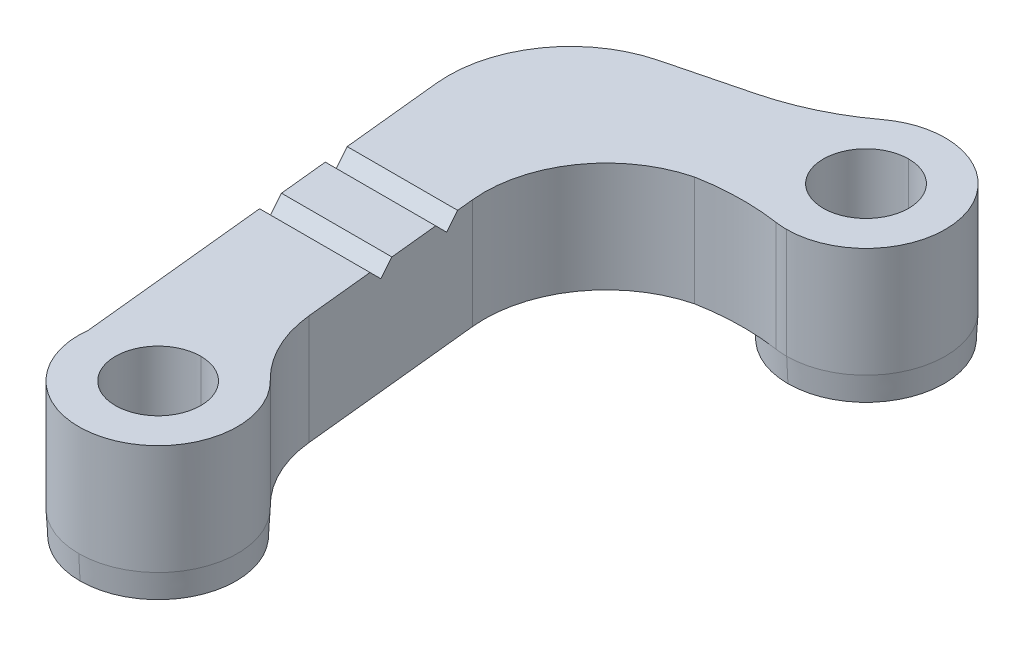
ISO-10303-21;
HEADER;
FILE_DESCRIPTION(('STEP AP214'),'2;1');
FILE_NAME('part.step','',(''),(''),'','','');
FILE_SCHEMA(('AUTOMOTIVE_DESIGN { 1 0 10303 214 1 1 1 1 }'));
ENDSEC;
DATA;
#1=APPLICATION_CONTEXT('core data for automotive mechanical design processes');
#2=APPLICATION_PROTOCOL_DEFINITION('international standard','automotive_design',2000,#1);
#3=PRODUCT_CONTEXT('',#1,'mechanical');
#4=PRODUCT('Part','Part','',(#3));
#5=PRODUCT_RELATED_PRODUCT_CATEGORY('part','',(#4));
#6=PRODUCT_DEFINITION_FORMATION('','',#4);
#7=PRODUCT_DEFINITION_CONTEXT('part definition',#1,'design');
#8=PRODUCT_DEFINITION('design','',#6,#7);
#9=PRODUCT_DEFINITION_SHAPE('','',#8);
#10=(LENGTH_UNIT() NAMED_UNIT(*) SI_UNIT(.MILLI.,.METRE.));
#11=(NAMED_UNIT(*) PLANE_ANGLE_UNIT() SI_UNIT($,.RADIAN.));
#12=(NAMED_UNIT(*) SI_UNIT($,.STERADIAN.) SOLID_ANGLE_UNIT());
#13=UNCERTAINTY_MEASURE_WITH_UNIT(LENGTH_MEASURE(1.E-05),#10,'distance_accuracy_value','');
#14=(GEOMETRIC_REPRESENTATION_CONTEXT(3) GLOBAL_UNCERTAINTY_ASSIGNED_CONTEXT((#13)) GLOBAL_UNIT_ASSIGNED_CONTEXT((#10,
#11,#12)) REPRESENTATION_CONTEXT('',''));
#15=CARTESIAN_POINT('',(0.,0.,0.));
#16=DIRECTION('',(0.,0.,1.));
#17=DIRECTION('',(1.,0.,0.));
#18=AXIS2_PLACEMENT_3D('',#15,#16,#17);
#19=CARTESIAN_POINT('',(0.,4.,-11.6880020050078));
#20=DIRECTION('',(0.,0.70710678118655,0.707106781186545));
#21=DIRECTION('',(1.,0.,0.));
#22=AXIS2_PLACEMENT_3D('',#19,#20,#21);
#23=PLANE('',#22);
#24=DIRECTION('',(0.0724619149618862,-0.705247924803771,0.705247924803775));
#25=VECTOR('',#24,1.);
#26=CARTESIAN_POINT('',(0.704052639154984,-1.5578314508662,-6.13017055414156));
#27=LINE('',#26,#25);
#28=CARTESIAN_POINT('',(0.0816302937531961,4.5,-12.1880020050078));
#29=VERTEX_POINT('',#28);
#30=CARTESIAN_POINT('',(0.133003656519239,4.,-11.6880020050078));
#31=VERTEX_POINT('',#30);
#32=EDGE_CURVE('E209',#29,#31,#27,.T.);
#33=ORIENTED_EDGE('',*,*,#32,.F.);
#34=DIRECTION('',(-1.,0.,0.));
#35=VECTOR('',#34,1.);
#36=CARTESIAN_POINT('',(0.,4.5,-12.1880020050078));
#37=LINE('',#36,#35);
#38=CARTESIAN_POINT('',(-4.44206034714536,4.5,-12.1880020050078));
#39=VERTEX_POINT('',#38);
#40=EDGE_CURVE('E271',#29,#39,#37,.T.);
#41=ORIENTED_EDGE('',*,*,#40,.T.);
#42=DIRECTION('',(-0.0724619149618862,0.705247924803771,-0.705247924803775));
#43=VECTOR('',#42,1.);
#44=CARTESIAN_POINT('',(-4.36763267637388,3.77562002208782,-11.4636220270956));
#45=LINE('',#44,#43);
#46=CARTESIAN_POINT('',(-4.39068698437932,4.,-11.6880020050078));
#47=VERTEX_POINT('',#46);
#48=EDGE_CURVE('E317',#47,#39,#45,.T.);
#49=ORIENTED_EDGE('',*,*,#48,.F.);
#50=DIRECTION('',(1.,0.,0.));
#51=VECTOR('',#50,1.);
#52=CARTESIAN_POINT('',(0.184377019285281,4.,-11.6880020050078));
#53=LINE('',#52,#51);
#54=EDGE_CURVE('E11',#47,#31,#53,.T.);
#55=ORIENTED_EDGE('',*,*,#54,.T.);
#56=EDGE_LOOP('',(#33,#41,#49,#55));
#57=FACE_BOUND('',#56,.T.);
#58=ADVANCED_FACE('F17',(#57),#23,.T.);
#59=CARTESIAN_POINT('',(0.,4.,-11.6880020050078));
#60=DIRECTION('',(0.,0.70710678118655,-0.707106781186545));
#61=DIRECTION('',(-1.,0.,0.));
#62=AXIS2_PLACEMENT_3D('',#59,#60,#61);
#63=PLANE('',#62);
#64=DIRECTION('',(1.,0.,0.));
#65=VECTOR('',#64,1.);
#66=CARTESIAN_POINT('',(0.,4.5,-11.1880020050078));
#67=LINE('',#66,#65);
#68=CARTESIAN_POINT('',(-4.33931362161327,4.5,-11.1880020050078));
#69=VERTEX_POINT('',#68);
#70=CARTESIAN_POINT('',(0.184377019285282,4.5,-11.1880020050078));
#71=VERTEX_POINT('',#70);
#72=EDGE_CURVE('E217',#69,#71,#67,.T.);
#73=ORIENTED_EDGE('',*,*,#72,.T.);
#74=DIRECTION('',(0.0724619149618862,0.705247924803771,0.705247924803775));
#75=VECTOR('',#74,1.);
#76=CARTESIAN_POINT('',(0.755156254309161,10.0552060863062,-5.63279591870154));
#77=LINE('',#76,#75);
#78=EDGE_CURVE('E202',#31,#71,#77,.T.);
#79=ORIENTED_EDGE('',*,*,#78,.F.);
#80=ORIENTED_EDGE('',*,*,#54,.F.);
#81=DIRECTION('',(-0.0724619149618862,-0.705247924803771,-0.705247924803775));
#82=VECTOR('',#81,1.);
#83=CARTESIAN_POINT('',(-4.36763267637388,4.22437997791218,-11.4636220270956));
#84=LINE('',#83,#82);
#85=EDGE_CURVE('E194',#69,#47,#84,.T.);
#86=ORIENTED_EDGE('',*,*,#85,.F.);
#87=EDGE_LOOP('',(#73,#79,#80,#86));
#88=FACE_BOUND('',#87,.T.);
#89=ADVANCED_FACE('F223',(#88),#63,.T.);
#90=CARTESIAN_POINT('',(0.,4.,-8.68800200500781));
#91=DIRECTION('',(0.,0.70710678118655,-0.707106781186545));
#92=DIRECTION('',(-1.,0.,0.));
#93=AXIS2_PLACEMENT_3D('',#90,#91,#92);
#94=PLANE('',#93);
#95=DIRECTION('',(-0.0724619149618862,-0.705247924803771,-0.705247924803775));
#96=VECTOR('',#95,1.);
#97=CARTESIAN_POINT('',(-4.06101098544881,4.20862779055234,-8.47937421445546));
#98=LINE('',#97,#96);
#99=CARTESIAN_POINT('',(-4.03107344501702,4.5,-8.1880020050078));
#100=VERTEX_POINT('',#99);
#101=CARTESIAN_POINT('',(-4.08244680778307,4.,-8.68800200500781));
#102=VERTEX_POINT('',#101);
#103=EDGE_CURVE('E255',#100,#102,#98,.T.);
#104=ORIENTED_EDGE('',*,*,#103,.F.);
#105=DIRECTION('',(1.,0.,0.));
#106=VECTOR('',#105,1.);
#107=CARTESIAN_POINT('',(0.,4.5,-8.1880020050078));
#108=LINE('',#107,#106);
#109=CARTESIAN_POINT('',(0.492617195881537,4.5,-8.1880020050078));
#110=VERTEX_POINT('',#109);
#111=EDGE_CURVE('E221',#100,#110,#108,.T.);
#112=ORIENTED_EDGE('',*,*,#111,.T.);
#113=DIRECTION('',(0.0724619149618862,0.705247924803771,0.705247924803775));
#114=VECTOR('',#113,1.);
#115=CARTESIAN_POINT('',(0.908467099771692,8.54732999262632,-4.14067201238146));
#116=LINE('',#115,#114);
#117=CARTESIAN_POINT('',(0.441243833115493,4.,-8.68800200500781));
#118=VERTEX_POINT('',#117);
#119=EDGE_CURVE('E347',#118,#110,#116,.T.);
#120=ORIENTED_EDGE('',*,*,#119,.F.);
#121=DIRECTION('',(-1.,0.,0.));
#122=VECTOR('',#121,1.);
#123=CARTESIAN_POINT('',(-4.1338201705491,4.,-8.6880020050078));
#124=LINE('',#123,#122);
#125=EDGE_CURVE('E20',#118,#102,#124,.T.);
#126=ORIENTED_EDGE('',*,*,#125,.T.);
#127=EDGE_LOOP('',(#104,#112,#120,#126));
#128=FACE_BOUND('',#127,.T.);
#129=ADVANCED_FACE('F393',(#128),#94,.T.);
#130=CARTESIAN_POINT('',(0.,4.,-8.6880020050078));
#131=DIRECTION('',(0.,0.70710678118655,0.707106781186545));
#132=DIRECTION('',(1.,0.,0.));
#133=AXIS2_PLACEMENT_3D('',#130,#131,#132);
#134=PLANE('',#133);
#135=DIRECTION('',(-1.,0.,0.));
#136=VECTOR('',#135,1.);
#137=CARTESIAN_POINT('',(0.,4.5,-9.1880020050078));
#138=LINE('',#137,#136);
#139=CARTESIAN_POINT('',(0.389870470349451,4.5,-9.18800200500781));
#140=VERTEX_POINT('',#139);
#141=CARTESIAN_POINT('',(-4.1338201705491,4.5,-9.1880020050078));
#142=VERTEX_POINT('',#141);
#143=EDGE_CURVE('E219',#140,#142,#138,.T.);
#144=ORIENTED_EDGE('',*,*,#143,.T.);
#145=DIRECTION('',(-0.0724619149618862,0.705247924803771,-0.705247924803775));
#146=VECTOR('',#145,1.);
#147=CARTESIAN_POINT('',(-4.06101098544881,3.79137220944765,-8.47937421445546));
#148=LINE('',#147,#146);
#149=EDGE_CURVE('E251',#102,#142,#148,.T.);
#150=ORIENTED_EDGE('',*,*,#149,.F.);
#151=ORIENTED_EDGE('',*,*,#125,.F.);
#152=DIRECTION('',(0.0724619149618862,-0.705247924803771,0.705247924803775));
#153=VECTOR('',#152,1.);
#154=CARTESIAN_POINT('',(0.857363484617515,-0.0499553571862892,-4.63804664782149));
#155=LINE('',#154,#153);
#156=EDGE_CURVE('E211',#140,#118,#155,.T.);
#157=ORIENTED_EDGE('',*,*,#156,.F.);
#158=EDGE_LOOP('',(#144,#150,#151,#157));
#159=FACE_BOUND('',#158,.T.);
#160=ADVANCED_FACE('F394',(#159),#134,.T.);
#161=CARTESIAN_POINT('',(7.5,0.,-21.5));
#162=DIRECTION('',(0.,-1.,0.));
#163=DIRECTION('',(0.,0.,-1.));
#164=AXIS2_PLACEMENT_3D('',#161,#162,#163);
#165=CONICAL_SURFACE('',#164,1.75,0.0523598775598306);
#166=DIRECTION('',(0.,-0.998629534754574,0.052335956242944));
#167=VECTOR('',#166,1.);
#168=CARTESIAN_POINT('',(7.5,0.,-19.75));
#169=LINE('',#168,#167);
#170=CARTESIAN_POINT('',(7.5,0.,-19.75));
#171=VERTEX_POINT('',#170);
#172=CARTESIAN_POINT('',(7.5,-1.,-19.697592220717));
#173=VERTEX_POINT('',#172);
#174=EDGE_CURVE('E634',#171,#173,#169,.T.);
#175=ORIENTED_EDGE('',*,*,#174,.F.);
#176=CARTESIAN_POINT('',(7.5,0.,-21.5));
#177=DIRECTION('',(0.,1.,0.));
#178=DIRECTION('',(0.,0.,1.));
#179=AXIS2_PLACEMENT_3D('',#176,#177,#178);
#180=CIRCLE('',#179,1.75);
#181=CARTESIAN_POINT('',(7.5,0.,-23.25));
#182=VERTEX_POINT('',#181);
#183=EDGE_CURVE('E318',#171,#182,#180,.T.);
#184=ORIENTED_EDGE('',*,*,#183,.T.);
#185=DIRECTION('',(0.,-0.998629534754574,-0.052335956242944));
#186=VECTOR('',#185,1.);
#187=CARTESIAN_POINT('',(7.5,0.,-23.25));
#188=LINE('',#187,#186);
#189=CARTESIAN_POINT('',(7.5,-1.,-23.302407779283));
#190=VERTEX_POINT('',#189);
#191=EDGE_CURVE('E643',#182,#190,#188,.T.);
#192=ORIENTED_EDGE('',*,*,#191,.T.);
#193=CARTESIAN_POINT('',(7.5,-1.,-21.5));
#194=DIRECTION('',(0.,-1.,0.));
#195=DIRECTION('',(0.,0.,-1.));
#196=AXIS2_PLACEMENT_3D('',#193,#194,#195);
#197=CIRCLE('',#196,1.80240777928305);
#198=EDGE_CURVE('E264',#190,#173,#197,.T.);
#199=ORIENTED_EDGE('',*,*,#198,.T.);
#200=EDGE_LOOP('',(#175,#184,#192,#199));
#201=FACE_BOUND('',#200,.T.);
#202=ADVANCED_FACE('F706',(#201),#165,.F.);
#203=CARTESIAN_POINT('',(7.5,0.,-21.5));
#204=DIRECTION('',(0.,1.,0.));
#205=DIRECTION('',(0.,0.,-1.));
#206=AXIS2_PLACEMENT_3D('',#203,#204,#205);
#207=CONICAL_SURFACE('',#206,3.25,0.0523598775598306);
#208=DIRECTION('',(0.,0.998629534754574,0.052335956242944));
#209=VECTOR('',#208,1.);
#210=CARTESIAN_POINT('',(7.5,0.,-18.25));
#211=LINE('',#210,#209);
#212=CARTESIAN_POINT('',(7.5,-1.,-18.3024077792831));
#213=VERTEX_POINT('',#212);
#214=CARTESIAN_POINT('',(7.5,0.,-18.25));
#215=VERTEX_POINT('',#214);
#216=EDGE_CURVE('E642',#213,#215,#211,.T.);
#217=ORIENTED_EDGE('',*,*,#216,.F.);
#218=CARTESIAN_POINT('',(7.5,-1.,-21.5));
#219=DIRECTION('',(0.,-1.,0.));
#220=DIRECTION('',(0.,0.,-1.));
#221=AXIS2_PLACEMENT_3D('',#218,#219,#220);
#222=CIRCLE('',#221,3.19759222071696);
#223=CARTESIAN_POINT('',(7.5,-1.,-24.6975922207169));
#224=VERTEX_POINT('',#223);
#225=EDGE_CURVE('E260',#224,#213,#222,.T.);
#226=ORIENTED_EDGE('',*,*,#225,.F.);
#227=DIRECTION('',(0.,0.998629534754574,-0.052335956242944));
#228=VECTOR('',#227,1.);
#229=CARTESIAN_POINT('',(7.5,0.,-24.75));
#230=LINE('',#229,#228);
#231=CARTESIAN_POINT('',(7.5,0.,-24.75));
#232=VERTEX_POINT('',#231);
#233=EDGE_CURVE('E652',#224,#232,#230,.T.);
#234=ORIENTED_EDGE('',*,*,#233,.T.);
#235=CARTESIAN_POINT('',(7.5,0.,-21.5));
#236=DIRECTION('',(0.,1.,0.));
#237=DIRECTION('',(0.,0.,1.));
#238=AXIS2_PLACEMENT_3D('',#235,#236,#237);
#239=CIRCLE('',#238,3.25);
#240=EDGE_CURVE('E482',#215,#232,#239,.T.);
#241=ORIENTED_EDGE('',*,*,#240,.F.);
#242=EDGE_LOOP('',(#217,#226,#234,#241));
#243=FACE_BOUND('',#242,.T.);
#244=ADVANCED_FACE('F707',(#243),#207,.T.);
#245=CARTESIAN_POINT('',(7.5,-1.,-21.5));
#246=DIRECTION('',(0.,-1.,0.));
#247=DIRECTION('',(0.,0.,-1.));
#248=AXIS2_PLACEMENT_3D('',#245,#246,#247);
#249=PLANE('',#248);
#250=ORIENTED_EDGE('',*,*,#198,.F.);
#251=CARTESIAN_POINT('',(7.5,-1.,-21.5));
#252=DIRECTION('',(0.,-1.,0.));
#253=DIRECTION('',(0.,0.,-1.));
#254=AXIS2_PLACEMENT_3D('',#251,#252,#253);
#255=CIRCLE('',#254,1.80240777928305);
#256=EDGE_CURVE('E638',#173,#190,#255,.T.);
#257=ORIENTED_EDGE('',*,*,#256,.F.);
#258=EDGE_LOOP('',(#250,#257));
#259=FACE_BOUND('',#258,.T.);
#260=ORIENTED_EDGE('',*,*,#225,.T.);
#261=CARTESIAN_POINT('',(7.5,-1.,-21.5));
#262=DIRECTION('',(0.,-1.,0.));
#263=DIRECTION('',(0.,0.,-1.));
#264=AXIS2_PLACEMENT_3D('',#261,#262,#263);
#265=CIRCLE('',#264,3.19759222071696);
#266=EDGE_CURVE('E639',#213,#224,#265,.T.);
#267=ORIENTED_EDGE('',*,*,#266,.T.);
#268=EDGE_LOOP('',(#260,#267));
#269=FACE_BOUND('',#268,.T.);
#270=ADVANCED_FACE('F710',(#259,#269),#249,.T.);
#271=CARTESIAN_POINT('',(0.,0.,0.));
#272=DIRECTION('',(0.,-1.,0.));
#273=DIRECTION('',(0.,0.,-1.));
#274=AXIS2_PLACEMENT_3D('',#271,#272,#273);
#275=CONICAL_SURFACE('',#274,1.75,0.0523598775598306);
#276=DIRECTION('',(0.,-0.998629534754574,0.052335956242944));
#277=VECTOR('',#276,1.);
#278=CARTESIAN_POINT('',(0.,0.,1.75));
#279=LINE('',#278,#277);
#280=CARTESIAN_POINT('',(0.,0.,1.75));
#281=VERTEX_POINT('',#280);
#282=CARTESIAN_POINT('',(0.,-1.,1.80240777928304));
#283=VERTEX_POINT('',#282);
#284=EDGE_CURVE('E669',#281,#283,#279,.T.);
#285=ORIENTED_EDGE('',*,*,#284,.F.);
#286=CARTESIAN_POINT('',(0.,0.,0.));
#287=DIRECTION('',(0.,1.,0.));
#288=DIRECTION('',(0.,0.,1.));
#289=AXIS2_PLACEMENT_3D('',#286,#287,#288);
#290=CIRCLE('',#289,1.75);
#291=CARTESIAN_POINT('',(0.,0.,-1.75));
#292=VERTEX_POINT('',#291);
#293=EDGE_CURVE('E348',#281,#292,#290,.T.);
#294=ORIENTED_EDGE('',*,*,#293,.T.);
#295=DIRECTION('',(0.,-0.998629534754574,-0.052335956242944));
#296=VECTOR('',#295,1.);
#297=CARTESIAN_POINT('',(0.,0.,-1.75));
#298=LINE('',#297,#296);
#299=CARTESIAN_POINT('',(0.,-1.,-1.80240777928304));
#300=VERTEX_POINT('',#299);
#301=EDGE_CURVE('E464',#292,#300,#298,.T.);
#302=ORIENTED_EDGE('',*,*,#301,.T.);
#303=CARTESIAN_POINT('',(0.,-1.,0.));
#304=DIRECTION('',(0.,-1.,0.));
#305=DIRECTION('',(0.,0.,-1.));
#306=AXIS2_PLACEMENT_3D('',#303,#304,#305);
#307=CIRCLE('',#306,1.80240777928304);
#308=EDGE_CURVE('E265',#300,#283,#307,.T.);
#309=ORIENTED_EDGE('',*,*,#308,.T.);
#310=EDGE_LOOP('',(#285,#294,#302,#309));
#311=FACE_BOUND('',#310,.T.);
#312=ADVANCED_FACE('F693',(#311),#275,.F.);
#313=CARTESIAN_POINT('',(0.,0.,0.));
#314=DIRECTION('',(0.,1.,0.));
#315=DIRECTION('',(0.,0.,-1.));
#316=AXIS2_PLACEMENT_3D('',#313,#314,#315);
#317=CONICAL_SURFACE('',#316,3.25,0.0523598775598306);
#318=DIRECTION('',(0.,0.998629534754574,0.052335956242944));
#319=VECTOR('',#318,1.);
#320=CARTESIAN_POINT('',(0.,0.,3.25));
#321=LINE('',#320,#319);
#322=CARTESIAN_POINT('',(0.,-1.,3.19759222071696));
#323=VERTEX_POINT('',#322);
#324=CARTESIAN_POINT('',(0.,0.,3.25));
#325=VERTEX_POINT('',#324);
#326=EDGE_CURVE('E452',#323,#325,#321,.T.);
#327=ORIENTED_EDGE('',*,*,#326,.F.);
#328=CARTESIAN_POINT('',(0.,-1.,0.));
#329=DIRECTION('',(0.,-1.,0.));
#330=DIRECTION('',(0.,0.,-1.));
#331=AXIS2_PLACEMENT_3D('',#328,#329,#330);
#332=CIRCLE('',#331,3.19759222071696);
#333=CARTESIAN_POINT('',(0.,-1.,-3.19759222071696));
#334=VERTEX_POINT('',#333);
#335=EDGE_CURVE('E293',#334,#323,#332,.T.);
#336=ORIENTED_EDGE('',*,*,#335,.F.);
#337=DIRECTION('',(0.,0.998629534754574,-0.052335956242944));
#338=VECTOR('',#337,1.);
#339=CARTESIAN_POINT('',(0.,0.,-3.25));
#340=LINE('',#339,#338);
#341=CARTESIAN_POINT('',(0.,0.,-3.25));
#342=VERTEX_POINT('',#341);
#343=EDGE_CURVE('E462',#334,#342,#340,.T.);
#344=ORIENTED_EDGE('',*,*,#343,.T.);
#345=CARTESIAN_POINT('',(0.,0.,0.));
#346=DIRECTION('',(0.,-1.,0.));
#347=DIRECTION('',(0.,0.,-1.));
#348=AXIS2_PLACEMENT_3D('',#345,#346,#347);
#349=CIRCLE('',#348,3.25);
#350=CARTESIAN_POINT('',(2.26618996291476,0.,-2.32956713832943));
#351=VERTEX_POINT('',#350);
#352=EDGE_CURVE('E279',#342,#351,#349,.T.);
#353=ORIENTED_EDGE('',*,*,#352,.T.);
#354=CARTESIAN_POINT('',(0.,0.,0.));
#355=DIRECTION('',(0.,1.,0.));
#356=DIRECTION('',(0.,0.,1.));
#357=AXIS2_PLACEMENT_3D('',#354,#355,#356);
#358=CIRCLE('',#357,3.25);
#359=EDGE_CURVE('E254',#325,#351,#358,.T.);
#360=ORIENTED_EDGE('',*,*,#359,.F.);
#361=EDGE_LOOP('',(#327,#336,#344,#353,#360));
#362=FACE_BOUND('',#361,.T.);
#363=ADVANCED_FACE('F453',(#362),#317,.T.);
#364=CARTESIAN_POINT('',(0.,-1.,0.));
#365=DIRECTION('',(0.,-1.,0.));
#366=DIRECTION('',(0.,0.,-1.));
#367=AXIS2_PLACEMENT_3D('',#364,#365,#366);
#368=PLANE('',#367);
#369=ORIENTED_EDGE('',*,*,#308,.F.);
#370=CARTESIAN_POINT('',(0.,-1.,0.));
#371=DIRECTION('',(0.,-1.,0.));
#372=DIRECTION('',(0.,0.,-1.));
#373=AXIS2_PLACEMENT_3D('',#370,#371,#372);
#374=CIRCLE('',#373,1.80240777928304);
#375=EDGE_CURVE('E471',#283,#300,#374,.T.);
#376=ORIENTED_EDGE('',*,*,#375,.F.);
#377=EDGE_LOOP('',(#369,#376));
#378=FACE_BOUND('',#377,.T.);
#379=ORIENTED_EDGE('',*,*,#335,.T.);
#380=CARTESIAN_POINT('',(0.,-1.,0.));
#381=DIRECTION('',(0.,-1.,0.));
#382=DIRECTION('',(0.,0.,-1.));
#383=AXIS2_PLACEMENT_3D('',#380,#381,#382);
#384=CIRCLE('',#383,3.19759222071696);
#385=EDGE_CURVE('E447',#323,#334,#384,.T.);
#386=ORIENTED_EDGE('',*,*,#385,.T.);
#387=EDGE_LOOP('',(#379,#386));
#388=FACE_BOUND('',#387,.T.);
#389=ADVANCED_FACE('F445',(#378,#388),#368,.T.);
#390=CARTESIAN_POINT('',(-0.418233497067205,4.5,-32.1237506694163));
#391=DIRECTION('',(0.,-1.,0.));
#392=DIRECTION('',(0.,0.,-1.));
#393=AXIS2_PLACEMENT_3D('',#390,#391,#392);
#394=CYLINDRICAL_SURFACE('',#393,10.);
#395=CARTESIAN_POINT('',(-0.418233497067205,4.5,-32.1237506694163));
#396=DIRECTION('',(0.,-1.,0.));
#397=DIRECTION('',(0.,0.,1.));
#398=AXIS2_PLACEMENT_3D('',#395,#396,#397);
#399=CIRCLE('',#398,10.);
#400=CARTESIAN_POINT('',(5.55779178373823,4.5,-24.1058256358946));
#401=VERTEX_POINT('',#400);
#402=CARTESIAN_POINT('',(2.0510323862635,4.5,-22.4334087767162));
#403=VERTEX_POINT('',#402);
#404=EDGE_CURVE('E366',#401,#403,#399,.T.);
#405=ORIENTED_EDGE('',*,*,#404,.F.);
#406=DIRECTION('',(0.,1.,0.));
#407=VECTOR('',#406,1.);
#408=CARTESIAN_POINT('',(5.55779178373823,4.5,-24.1058256358946));
#409=LINE('',#408,#407);
#410=CARTESIAN_POINT('',(5.55779178373823,0.,-24.1058256358946));
#411=VERTEX_POINT('',#410);
#412=EDGE_CURVE('E226',#411,#401,#409,.T.);
#413=ORIENTED_EDGE('',*,*,#412,.F.);
#414=CARTESIAN_POINT('',(-0.418233497067205,0.,-32.1237506694163));
#415=DIRECTION('',(0.,1.,0.));
#416=DIRECTION('',(0.,0.,1.));
#417=AXIS2_PLACEMENT_3D('',#414,#415,#416);
#418=CIRCLE('',#417,10.);
#419=CARTESIAN_POINT('',(2.0510323862635,0.,-22.4334087767162));
#420=VERTEX_POINT('',#419);
#421=EDGE_CURVE('E300',#420,#411,#418,.T.);
#422=ORIENTED_EDGE('',*,*,#421,.F.);
#423=DIRECTION('',(0.,-1.,0.));
#424=VECTOR('',#423,1.);
#425=CARTESIAN_POINT('',(2.05103238626349,4.5,-22.4334087767162));
#426=LINE('',#425,#424);
#427=EDGE_CURVE('E307',#403,#420,#426,.T.);
#428=ORIENTED_EDGE('',*,*,#427,.F.);
#429=EDGE_LOOP('',(#405,#413,#422,#428));
#430=FACE_BOUND('',#429,.T.);
#431=ADVANCED_FACE('F581',(#430),#394,.F.);
#432=CARTESIAN_POINT('',(5.57508380314158,4.5,-8.39056837101348));
#433=DIRECTION('',(0.,1.,0.));
#434=DIRECTION('',(0.,0.,1.));
#435=AXIS2_PLACEMENT_3D('',#432,#433,#434);
#436=CYLINDRICAL_SURFACE('',#435,10.);
#437=CARTESIAN_POINT('',(5.57508380314158,4.5,-8.39056837101348));
#438=DIRECTION('',(0.,-1.,0.));
#439=DIRECTION('',(0.,0.,1.));
#440=AXIS2_PLACEMENT_3D('',#437,#438,#439);
#441=CIRCLE('',#440,10.);
#442=CARTESIAN_POINT('',(3.75108862943803,4.5,-18.2228133642134));
#443=VERTEX_POINT('',#442);
#444=CARTESIAN_POINT('',(7.0278507441668,4.5,-18.2844790343995));
#445=VERTEX_POINT('',#444);
#446=EDGE_CURVE('E270',#443,#445,#441,.T.);
#447=ORIENTED_EDGE('',*,*,#446,.F.);
#448=DIRECTION('',(0.,-1.,0.));
#449=VECTOR('',#448,1.);
#450=CARTESIAN_POINT('',(3.75108862943803,0.,-18.2228133642134));
#451=LINE('',#450,#449);
#452=CARTESIAN_POINT('',(3.75108862943803,0.,-18.2228133642134));
#453=VERTEX_POINT('',#452);
#454=EDGE_CURVE('E40',#443,#453,#451,.T.);
#455=ORIENTED_EDGE('',*,*,#454,.T.);
#456=CARTESIAN_POINT('',(5.57508380314158,0.,-8.39056837101348));
#457=DIRECTION('',(0.,1.,0.));
#458=DIRECTION('',(0.,0.,1.));
#459=AXIS2_PLACEMENT_3D('',#456,#457,#458);
#460=CIRCLE('',#459,10.);
#461=CARTESIAN_POINT('',(7.0278507441668,0.,-18.2844790343995));
#462=VERTEX_POINT('',#461);
#463=EDGE_CURVE('E274',#462,#453,#460,.T.);
#464=ORIENTED_EDGE('',*,*,#463,.F.);
#465=DIRECTION('',(0.,-1.,0.));
#466=VECTOR('',#465,1.);
#467=CARTESIAN_POINT('',(7.0278507441668,4.5,-18.2844790343995));
#468=LINE('',#467,#466);
#469=EDGE_CURVE('E301',#445,#462,#468,.T.);
#470=ORIENTED_EDGE('',*,*,#469,.F.);
#471=EDGE_LOOP('',(#447,#455,#464,#470));
#472=FACE_BOUND('',#471,.T.);
#473=ADVANCED_FACE('F558',(#472),#436,.F.);
#474=CARTESIAN_POINT('',(5.7526360597067,4.5,-5.91351658191318));
#475=DIRECTION('',(0.,-1.,0.));
#476=DIRECTION('',(0.,0.,-1.));
#477=AXIS2_PLACEMENT_3D('',#474,#475,#476);
#478=CYLINDRICAL_SURFACE('',#477,5.);
#479=CARTESIAN_POINT('',(5.7526360597067,4.5,-5.91351658191318));
#480=DIRECTION('',(0.,-1.,0.));
#481=DIRECTION('',(0.,0.,1.));
#482=AXIS2_PLACEMENT_3D('',#479,#480,#481);
#483=CIRCLE('',#482,5.);
#484=CARTESIAN_POINT('',(2.26618996291476,4.5,-2.32956713832943));
#485=VERTEX_POINT('',#484);
#486=CARTESIAN_POINT('',(0.778821140406484,4.5,-5.40247338555246));
#487=VERTEX_POINT('',#486);
#488=EDGE_CURVE('E246',#485,#487,#483,.T.);
#489=ORIENTED_EDGE('',*,*,#488,.F.);
#490=DIRECTION('',(0.,1.,0.));
#491=VECTOR('',#490,1.);
#492=CARTESIAN_POINT('',(2.26618996291476,4.5,-2.32956713832943));
#493=LINE('',#492,#491);
#494=EDGE_CURVE('E337',#351,#485,#493,.T.);
#495=ORIENTED_EDGE('',*,*,#494,.F.);
#496=CARTESIAN_POINT('',(5.7526360597067,0.,-5.91351658191318));
#497=DIRECTION('',(0.,1.,0.));
#498=DIRECTION('',(0.,0.,1.));
#499=AXIS2_PLACEMENT_3D('',#496,#497,#498);
#500=CIRCLE('',#499,5.);
#501=CARTESIAN_POINT('',(0.778821140406484,0.,-5.40247338555246));
#502=VERTEX_POINT('',#501);
#503=EDGE_CURVE('E275',#502,#351,#500,.T.);
#504=ORIENTED_EDGE('',*,*,#503,.F.);
#505=DIRECTION('',(0.,-1.,0.));
#506=VECTOR('',#505,1.);
#507=CARTESIAN_POINT('',(0.778821140406484,0.,-5.40247338555245));
#508=LINE('',#507,#506);
#509=EDGE_CURVE('E343',#487,#502,#508,.T.);
#510=ORIENTED_EDGE('',*,*,#509,.F.);
#511=EDGE_LOOP('',(#489,#495,#504,#510));
#512=FACE_BOUND('',#511,.T.);
#513=ADVANCED_FACE('F766',(#512),#478,.F.);
#514=CARTESIAN_POINT('',(4.98572157110337,4.5,-13.3776424178634));
#515=DIRECTION('',(0.,1.,0.));
#516=DIRECTION('',(0.,0.,1.));
#517=AXIS2_PLACEMENT_3D('',#514,#515,#516);
#518=CYLINDRICAL_SURFACE('',#517,5.);
#519=CARTESIAN_POINT('',(4.98572157110337,4.5,-13.3776424178634));
#520=DIRECTION('',(0.,-1.,0.));
#521=DIRECTION('',(0.,0.,1.));
#522=AXIS2_PLACEMENT_3D('',#519,#520,#521);
#523=CIRCLE('',#522,5.);
#524=CARTESIAN_POINT('',(0.0119066518031606,4.5,-12.8665992215027));
#525=VERTEX_POINT('',#524);
#526=EDGE_CURVE('E266',#525,#443,#523,.T.);
#527=ORIENTED_EDGE('',*,*,#526,.F.);
#528=DIRECTION('',(0.,1.,0.));
#529=VECTOR('',#528,1.);
#530=CARTESIAN_POINT('',(0.011906651803161,4.5,-12.8665992215027));
#531=LINE('',#530,#529);
#532=CARTESIAN_POINT('',(0.0119066518031606,0.,-12.8665992215027));
#533=VERTEX_POINT('',#532);
#534=EDGE_CURVE('E346',#533,#525,#531,.T.);
#535=ORIENTED_EDGE('',*,*,#534,.F.);
#536=CARTESIAN_POINT('',(4.98572157110337,0.,-13.3776424178634));
#537=DIRECTION('',(0.,1.,0.));
#538=DIRECTION('',(0.,0.,1.));
#539=AXIS2_PLACEMENT_3D('',#536,#537,#538);
#540=CIRCLE('',#539,5.);
#541=EDGE_CURVE('E520',#453,#533,#540,.T.);
#542=ORIENTED_EDGE('',*,*,#541,.F.);
#543=ORIENTED_EDGE('',*,*,#454,.F.);
#544=EDGE_LOOP('',(#527,#535,#542,#543));
#545=FACE_BOUND('',#544,.T.);
#546=ADVANCED_FACE('F549',(#545),#518,.F.);
#547=CARTESIAN_POINT('',(0.112485082571291,4.5,-16.779656893978));
#548=DIRECTION('',(0.,-1.,0.));
#549=DIRECTION('',(0.,0.,-1.));
#550=AXIS2_PLACEMENT_3D('',#547,#548,#549);
#551=CYLINDRICAL_SURFACE('',#550,5.);
#552=CARTESIAN_POINT('',(0.112485082571291,4.5,-16.779656893978));
#553=DIRECTION('',(0.,1.,0.));
#554=DIRECTION('',(0.,0.,1.));
#555=AXIS2_PLACEMENT_3D('',#552,#553,#554);
#556=CIRCLE('',#555,5.);
#557=CARTESIAN_POINT('',(-1.12214785909406,4.5,-21.624827840328));
#558=VERTEX_POINT('',#557);
#559=CARTESIAN_POINT('',(-4.86132983672892,4.5,-16.2686136976173));
#560=VERTEX_POINT('',#559);
#561=EDGE_CURVE('E369',#558,#560,#556,.T.);
#562=ORIENTED_EDGE('',*,*,#561,.F.);
#563=DIRECTION('',(0.,1.,0.));
#564=VECTOR('',#563,1.);
#565=CARTESIAN_POINT('',(-1.12214785909406,4.5,-21.624827840328));
#566=LINE('',#565,#564);
#567=CARTESIAN_POINT('',(-1.12214785909406,0.,-21.624827840328));
#568=VERTEX_POINT('',#567);
#569=EDGE_CURVE('E311',#568,#558,#566,.T.);
#570=ORIENTED_EDGE('',*,*,#569,.F.);
#571=CARTESIAN_POINT('',(0.112485082571291,0.,-16.779656893978));
#572=DIRECTION('',(0.,-1.,0.));
#573=DIRECTION('',(0.,0.,1.));
#574=AXIS2_PLACEMENT_3D('',#571,#572,#573);
#575=CIRCLE('',#574,5.);
#576=CARTESIAN_POINT('',(-4.86132983672892,0.,-16.2686136976173));
#577=VERTEX_POINT('',#576);
#578=EDGE_CURVE('E288',#577,#568,#575,.T.);
#579=ORIENTED_EDGE('',*,*,#578,.F.);
#580=DIRECTION('',(0.,-1.,0.));
#581=VECTOR('',#580,1.);
#582=CARTESIAN_POINT('',(-4.86132983672892,4.5,-16.2686136976173));
#583=LINE('',#582,#581);
#584=EDGE_CURVE('E330',#560,#577,#583,.T.);
#585=ORIENTED_EDGE('',*,*,#584,.F.);
#586=EDGE_LOOP('',(#562,#570,#579,#585));
#587=FACE_BOUND('',#586,.T.);
#588=ADVANCED_FACE('F546',(#587),#551,.T.);
#589=CARTESIAN_POINT('',(0.,4.5,0.));
#590=DIRECTION('',(0.,1.,0.));
#591=DIRECTION('',(1.,0.,0.));
#592=AXIS2_PLACEMENT_3D('',#589,#590,#591);
#593=PLANE('',#592);
#594=CARTESIAN_POINT('',(7.5,4.5,-21.5));
#595=DIRECTION('',(0.,1.,0.));
#596=DIRECTION('',(0.,0.,1.));
#597=AXIS2_PLACEMENT_3D('',#594,#595,#596);
#598=CIRCLE('',#597,1.75);
#599=CARTESIAN_POINT('',(7.5,4.5,-23.25));
#600=VERTEX_POINT('',#599);
#601=CARTESIAN_POINT('',(7.5,4.5,-19.75));
#602=VERTEX_POINT('',#601);
#603=EDGE_CURVE('E491',#600,#602,#598,.T.);
#604=ORIENTED_EDGE('',*,*,#603,.F.);
#605=CARTESIAN_POINT('',(7.5,4.5,-21.5));
#606=DIRECTION('',(0.,1.,0.));
#607=DIRECTION('',(0.,0.,1.));
#608=AXIS2_PLACEMENT_3D('',#605,#606,#607);
#609=CIRCLE('',#608,1.75);
#610=EDGE_CURVE('E322',#602,#600,#609,.T.);
#611=ORIENTED_EDGE('',*,*,#610,.F.);
#612=EDGE_LOOP('',(#604,#611));
#613=FACE_BOUND('',#612,.T.);
#614=ORIENTED_EDGE('',*,*,#40,.F.);
#615=DIRECTION('',(-0.102208639272146,0.,-0.994762983860043));
#616=VECTOR('',#615,1.);
#617=CARTESIAN_POINT('',(1.31997278358494,4.5,-0.135622881304824));
#618=LINE('',#617,#616);
#619=EDGE_CURVE('E362',#29,#525,#618,.T.);
#620=ORIENTED_EDGE('',*,*,#619,.T.);
#621=ORIENTED_EDGE('',*,*,#526,.T.);
#622=ORIENTED_EDGE('',*,*,#446,.T.);
#623=CARTESIAN_POINT('',(7.5,4.5,-21.5));
#624=DIRECTION('',(0.,1.,0.));
#625=DIRECTION('',(0.,0.,1.));
#626=AXIS2_PLACEMENT_3D('',#623,#624,#625);
#627=CIRCLE('',#626,3.25);
#628=CARTESIAN_POINT('',(7.5,4.5,-18.25));
#629=VERTEX_POINT('',#628);
#630=EDGE_CURVE('E306',#445,#629,#627,.T.);
#631=ORIENTED_EDGE('',*,*,#630,.T.);
#632=CARTESIAN_POINT('',(7.5,4.5,-21.5));
#633=DIRECTION('',(0.,1.,0.));
#634=DIRECTION('',(0.,0.,1.));
#635=AXIS2_PLACEMENT_3D('',#632,#633,#634);
#636=CIRCLE('',#635,3.25);
#637=CARTESIAN_POINT('',(7.5,4.5,-24.75));
#638=VERTEX_POINT('',#637);
#639=EDGE_CURVE('E483',#629,#638,#636,.T.);
#640=ORIENTED_EDGE('',*,*,#639,.T.);
#641=CARTESIAN_POINT('',(7.5,4.5,-21.5));
#642=DIRECTION('',(0.,1.,0.));
#643=DIRECTION('',(0.,0.,1.));
#644=AXIS2_PLACEMENT_3D('',#641,#642,#643);
#645=CIRCLE('',#644,3.25);
#646=EDGE_CURVE('E234',#638,#401,#645,.T.);
#647=ORIENTED_EDGE('',*,*,#646,.T.);
#648=ORIENTED_EDGE('',*,*,#404,.T.);
#649=DIRECTION('',(0.969034189270013,0.,-0.246926588333069));
#650=VECTOR('',#649,1.);
#651=CARTESIAN_POINT('',(-5.24281585974858,4.5,-20.5748107177936));
#652=LINE('',#651,#650);
#653=EDGE_CURVE('E305',#558,#403,#652,.T.);
#654=ORIENTED_EDGE('',*,*,#653,.F.);
#655=ORIENTED_EDGE('',*,*,#561,.T.);
#656=DIRECTION('',(-0.102208639272146,0.,-0.994762983860043));
#657=VECTOR('',#656,1.);
#658=CARTESIAN_POINT('',(-3.15646064378525,4.5,0.324315995419833));
#659=LINE('',#658,#657);
#660=EDGE_CURVE('E326',#39,#560,#659,.T.);
#661=ORIENTED_EDGE('',*,*,#660,.F.);
#662=EDGE_LOOP('',(#614,#620,#621,#622,#631,#640,#647,#648,#654,#655,#661));
#663=FACE_BOUND('',#662,.T.);
#664=ADVANCED_FACE('F543',(#613,#663),#593,.T.);
#665=CARTESIAN_POINT('',(7.5,4.5,-21.5));
#666=DIRECTION('',(0.,-1.,0.));
#667=DIRECTION('',(0.,0.,-1.));
#668=AXIS2_PLACEMENT_3D('',#665,#666,#667);
#669=CYLINDRICAL_SURFACE('',#668,1.75);
#670=DIRECTION('',(0.,-1.,0.));
#671=VECTOR('',#670,1.);
#672=CARTESIAN_POINT('',(7.5,4.5,-19.75));
#673=LINE('',#672,#671);
#674=EDGE_CURVE('E495',#602,#171,#673,.T.);
#675=ORIENTED_EDGE('',*,*,#674,.F.);
#676=ORIENTED_EDGE('',*,*,#610,.T.);
#677=DIRECTION('',(0.,-1.,0.));
#678=VECTOR('',#677,1.);
#679=CARTESIAN_POINT('',(7.5,4.5,-23.25));
#680=LINE('',#679,#678);
#681=EDGE_CURVE('E499',#600,#182,#680,.T.);
#682=ORIENTED_EDGE('',*,*,#681,.T.);
#683=ORIENTED_EDGE('',*,*,#183,.F.);
#684=EDGE_LOOP('',(#675,#676,#682,#683));
#685=FACE_BOUND('',#684,.T.);
#686=ADVANCED_FACE('F755',(#685),#669,.F.);
#687=CARTESIAN_POINT('',(1.31997278358494,4.5,-0.135622881304824));
#688=DIRECTION('',(-0.994762983860043,0.,0.102208639272146));
#689=DIRECTION('',(0.,1.,0.));
#690=AXIS2_PLACEMENT_3D('',#687,#688,#689);
#691=PLANE('',#690);
#692=ORIENTED_EDGE('',*,*,#32,.T.);
#693=ORIENTED_EDGE('',*,*,#78,.T.);
#694=DIRECTION('',(-0.102208639272146,0.,-0.994762983860043));
#695=VECTOR('',#694,1.);
#696=CARTESIAN_POINT('',(1.31997278358494,4.5,-0.135622881304824));
#697=LINE('',#696,#695);
#698=EDGE_CURVE('E206',#140,#71,#697,.T.);
#699=ORIENTED_EDGE('',*,*,#698,.F.);
#700=ORIENTED_EDGE('',*,*,#156,.T.);
#701=ORIENTED_EDGE('',*,*,#119,.T.);
#702=DIRECTION('',(-0.102208639272146,0.,-0.994762983860043));
#703=VECTOR('',#702,1.);
#704=CARTESIAN_POINT('',(1.31997278358494,4.5,-0.135622881304824));
#705=LINE('',#704,#703);
#706=EDGE_CURVE('E250',#487,#110,#705,.T.);
#707=ORIENTED_EDGE('',*,*,#706,.F.);
#708=ORIENTED_EDGE('',*,*,#509,.T.);
#709=DIRECTION('',(-0.102208639272146,0.,-0.994762983860043));
#710=VECTOR('',#709,1.);
#711=CARTESIAN_POINT('',(1.31997278358494,0.,-0.135622881304824));
#712=LINE('',#711,#710);
#713=EDGE_CURVE('E280',#502,#533,#712,.T.);
#714=ORIENTED_EDGE('',*,*,#713,.T.);
#715=ORIENTED_EDGE('',*,*,#534,.T.);
#716=ORIENTED_EDGE('',*,*,#619,.F.);
#717=EDGE_LOOP('',(#692,#693,#699,#700,#701,#707,#708,#714,#715,#716));
#718=FACE_BOUND('',#717,.T.);
#719=ADVANCED_FACE('F204',(#718),#691,.F.);
#720=CARTESIAN_POINT('',(0.,4.5,0.));
#721=DIRECTION('',(0.,-1.,0.));
#722=DIRECTION('',(0.,0.,-1.));
#723=AXIS2_PLACEMENT_3D('',#720,#721,#722);
#724=CYLINDRICAL_SURFACE('',#723,1.75);
#725=DIRECTION('',(0.,-1.,0.));
#726=VECTOR('',#725,1.);
#727=CARTESIAN_POINT('',(0.,4.5,1.75));
#728=LINE('',#727,#726);
#729=CARTESIAN_POINT('',(0.,4.5,1.75));
#730=VERTEX_POINT('',#729);
#731=EDGE_CURVE('E507',#730,#281,#728,.T.);
#732=ORIENTED_EDGE('',*,*,#731,.F.);
#733=CARTESIAN_POINT('',(0.,4.5,0.));
#734=DIRECTION('',(0.,1.,0.));
#735=DIRECTION('',(0.,0.,1.));
#736=AXIS2_PLACEMENT_3D('',#733,#734,#735);
#737=CIRCLE('',#736,1.75);
#738=CARTESIAN_POINT('',(0.,4.5,-1.75));
#739=VERTEX_POINT('',#738);
#740=EDGE_CURVE('E259',#730,#739,#737,.T.);
#741=ORIENTED_EDGE('',*,*,#740,.T.);
#742=DIRECTION('',(0.,-1.,0.));
#743=VECTOR('',#742,1.);
#744=CARTESIAN_POINT('',(0.,4.5,-1.75));
#745=LINE('',#744,#743);
#746=EDGE_CURVE('E513',#739,#292,#745,.T.);
#747=ORIENTED_EDGE('',*,*,#746,.T.);
#748=ORIENTED_EDGE('',*,*,#293,.F.);
#749=EDGE_LOOP('',(#732,#741,#747,#748));
#750=FACE_BOUND('',#749,.T.);
#751=ADVANCED_FACE('F724',(#750),#724,.F.);
#752=CARTESIAN_POINT('',(0.,4.5,0.));
#753=DIRECTION('',(0.,-1.,0.));
#754=DIRECTION('',(0.,0.,-1.));
#755=AXIS2_PLACEMENT_3D('',#752,#753,#754);
#756=CYLINDRICAL_SURFACE('',#755,3.25);
#757=CARTESIAN_POINT('',(0.,0.,0.));
#758=DIRECTION('',(0.,1.,0.));
#759=DIRECTION('',(0.,0.,1.));
#760=AXIS2_PLACEMENT_3D('',#757,#758,#759);
#761=CIRCLE('',#760,3.25);
#762=CARTESIAN_POINT('',(-3.228303600126,0.,-0.374907809219171));
#763=VERTEX_POINT('',#762);
#764=EDGE_CURVE('E458',#763,#325,#761,.T.);
#765=ORIENTED_EDGE('',*,*,#764,.T.);
#766=ORIENTED_EDGE('',*,*,#359,.T.);
#767=ORIENTED_EDGE('',*,*,#494,.T.);
#768=CARTESIAN_POINT('',(0.,4.5,0.));
#769=DIRECTION('',(0.,1.,0.));
#770=DIRECTION('',(0.,0.,1.));
#771=AXIS2_PLACEMENT_3D('',#768,#769,#770);
#772=CIRCLE('',#771,3.25);
#773=CARTESIAN_POINT('',(-3.228303600126,4.5,-0.374907809219171));
#774=VERTEX_POINT('',#773);
#775=EDGE_CURVE('E245',#774,#485,#772,.T.);
#776=ORIENTED_EDGE('',*,*,#775,.F.);
#777=DIRECTION('',(0.,-1.,0.));
#778=VECTOR('',#777,1.);
#779=CARTESIAN_POINT('',(-3.228303600126,4.5,-0.374907809219171));
#780=LINE('',#779,#778);
#781=EDGE_CURVE('E333',#774,#763,#780,.T.);
#782=ORIENTED_EDGE('',*,*,#781,.T.);
#783=EDGE_LOOP('',(#765,#766,#767,#776,#782));
#784=FACE_BOUND('',#783,.T.);
#785=ADVANCED_FACE('F623',(#784),#756,.T.);
#786=CARTESIAN_POINT('',(-3.15646064378525,4.5,0.324315995419833));
#787=DIRECTION('',(-0.994762983860043,0.,0.102208639272146));
#788=DIRECTION('',(0.,1.,0.));
#789=AXIS2_PLACEMENT_3D('',#786,#787,#788);
#790=PLANE('',#789);
#791=DIRECTION('',(-0.102208639272146,0.,-0.994762983860043));
#792=VECTOR('',#791,1.);
#793=CARTESIAN_POINT('',(-3.15646064378525,4.5,0.324315995419833));
#794=LINE('',#793,#792);
#795=EDGE_CURVE('E225',#142,#69,#794,.T.);
#796=ORIENTED_EDGE('',*,*,#795,.T.);
#797=ORIENTED_EDGE('',*,*,#85,.T.);
#798=ORIENTED_EDGE('',*,*,#48,.T.);
#799=ORIENTED_EDGE('',*,*,#660,.T.);
#800=ORIENTED_EDGE('',*,*,#584,.T.);
#801=DIRECTION('',(-0.102208639272146,0.,-0.994762983860043));
#802=VECTOR('',#801,1.);
#803=CARTESIAN_POINT('',(-3.15646064378525,0.,0.324315995419833));
#804=LINE('',#803,#802);
#805=EDGE_CURVE('E284',#763,#577,#804,.T.);
#806=ORIENTED_EDGE('',*,*,#805,.F.);
#807=ORIENTED_EDGE('',*,*,#781,.F.);
#808=DIRECTION('',(-0.102208639272146,0.,-0.994762983860043));
#809=VECTOR('',#808,1.);
#810=CARTESIAN_POINT('',(-3.15646064378525,4.5,0.324315995419833));
#811=LINE('',#810,#809);
#812=EDGE_CURVE('E241',#774,#100,#811,.T.);
#813=ORIENTED_EDGE('',*,*,#812,.T.);
#814=ORIENTED_EDGE('',*,*,#103,.T.);
#815=ORIENTED_EDGE('',*,*,#149,.T.);
#816=EDGE_LOOP('',(#796,#797,#798,#799,#800,#806,#807,#813,#814,#815));
#817=FACE_BOUND('',#816,.T.);
#818=ADVANCED_FACE('F396',(#817),#790,.T.);
#819=CARTESIAN_POINT('',(-5.24281585974858,4.5,-20.5748107177936));
#820=DIRECTION('',(-0.246926588333069,0.,-0.969034189270013));
#821=DIRECTION('',(-0.969034189270013,0.,0.246926588333069));
#822=AXIS2_PLACEMENT_3D('',#819,#820,#821);
#823=PLANE('',#822);
#824=ORIENTED_EDGE('',*,*,#653,.T.);
#825=ORIENTED_EDGE('',*,*,#427,.T.);
#826=DIRECTION('',(0.969034189270013,0.,-0.246926588333069));
#827=VECTOR('',#826,1.);
#828=CARTESIAN_POINT('',(-5.24281585974858,0.,-20.5748107177936));
#829=LINE('',#828,#827);
#830=EDGE_CURVE('E292',#568,#420,#829,.T.);
#831=ORIENTED_EDGE('',*,*,#830,.F.);
#832=ORIENTED_EDGE('',*,*,#569,.T.);
#833=EDGE_LOOP('',(#824,#825,#831,#832));
#834=FACE_BOUND('',#833,.T.);
#835=ADVANCED_FACE('F619',(#834),#823,.T.);
#836=CARTESIAN_POINT('',(7.5,4.5,-21.5));
#837=DIRECTION('',(0.,-1.,0.));
#838=DIRECTION('',(0.,0.,-1.));
#839=AXIS2_PLACEMENT_3D('',#836,#837,#838);
#840=CYLINDRICAL_SURFACE('',#839,3.25);
#841=DIRECTION('',(0.,-1.,0.));
#842=VECTOR('',#841,1.);
#843=CARTESIAN_POINT('',(7.5,4.5,-18.25));
#844=LINE('',#843,#842);
#845=EDGE_CURVE('E478',#629,#215,#844,.T.);
#846=ORIENTED_EDGE('',*,*,#845,.F.);
#847=ORIENTED_EDGE('',*,*,#630,.F.);
#848=ORIENTED_EDGE('',*,*,#469,.T.);
#849=CARTESIAN_POINT('',(7.5,0.,-21.5));
#850=DIRECTION('',(0.,1.,0.));
#851=DIRECTION('',(0.,0.,1.));
#852=AXIS2_PLACEMENT_3D('',#849,#850,#851);
#853=CIRCLE('',#852,3.25);
#854=EDGE_CURVE('E565',#462,#215,#853,.T.);
#855=ORIENTED_EDGE('',*,*,#854,.T.);
#856=EDGE_LOOP('',(#846,#847,#848,#855));
#857=FACE_BOUND('',#856,.T.);
#858=ADVANCED_FACE('F562',(#857),#840,.T.);
#859=CARTESIAN_POINT('',(0.,0.,0.));
#860=DIRECTION('',(0.,1.,0.));
#861=DIRECTION('',(1.,0.,0.));
#862=AXIS2_PLACEMENT_3D('',#859,#860,#861);
#863=PLANE('',#862);
#864=CARTESIAN_POINT('',(7.5,0.,-21.5));
#865=DIRECTION('',(0.,-1.,0.));
#866=DIRECTION('',(0.,0.,-1.));
#867=AXIS2_PLACEMENT_3D('',#864,#865,#866);
#868=CIRCLE('',#867,3.25);
#869=EDGE_CURVE('E659',#462,#411,#868,.T.);
#870=ORIENTED_EDGE('',*,*,#869,.F.);
#871=ORIENTED_EDGE('',*,*,#463,.T.);
#872=ORIENTED_EDGE('',*,*,#541,.T.);
#873=ORIENTED_EDGE('',*,*,#713,.F.);
#874=ORIENTED_EDGE('',*,*,#503,.T.);
#875=ORIENTED_EDGE('',*,*,#352,.F.);
#876=CARTESIAN_POINT('',(0.,0.,0.));
#877=DIRECTION('',(0.,-1.,0.));
#878=DIRECTION('',(0.,0.,-1.));
#879=AXIS2_PLACEMENT_3D('',#876,#877,#878);
#880=CIRCLE('',#879,3.25);
#881=EDGE_CURVE('E477',#763,#342,#880,.T.);
#882=ORIENTED_EDGE('',*,*,#881,.F.);
#883=ORIENTED_EDGE('',*,*,#805,.T.);
#884=ORIENTED_EDGE('',*,*,#578,.T.);
#885=ORIENTED_EDGE('',*,*,#830,.T.);
#886=ORIENTED_EDGE('',*,*,#421,.T.);
#887=EDGE_LOOP('',(#870,#871,#872,#873,#874,#875,#882,#883,#884,#885,#886));
#888=FACE_BOUND('',#887,.T.);
#889=ADVANCED_FACE('F620',(#888),#863,.F.);
#890=CARTESIAN_POINT('',(0.,4.5,0.));
#891=DIRECTION('',(0.,1.,0.));
#892=DIRECTION('',(1.,0.,0.));
#893=AXIS2_PLACEMENT_3D('',#890,#891,#892);
#894=PLANE('',#893);
#895=CARTESIAN_POINT('',(0.,4.5,0.));
#896=DIRECTION('',(0.,1.,0.));
#897=DIRECTION('',(0.,0.,1.));
#898=AXIS2_PLACEMENT_3D('',#895,#896,#897);
#899=CIRCLE('',#898,1.75);
#900=EDGE_CURVE('E503',#739,#730,#899,.T.);
#901=ORIENTED_EDGE('',*,*,#900,.F.);
#902=ORIENTED_EDGE('',*,*,#740,.F.);
#903=EDGE_LOOP('',(#901,#902));
#904=FACE_BOUND('',#903,.T.);
#905=ORIENTED_EDGE('',*,*,#111,.F.);
#906=ORIENTED_EDGE('',*,*,#812,.F.);
#907=ORIENTED_EDGE('',*,*,#775,.T.);
#908=ORIENTED_EDGE('',*,*,#488,.T.);
#909=ORIENTED_EDGE('',*,*,#706,.T.);
#910=EDGE_LOOP('',(#905,#906,#907,#908,#909));
#911=FACE_BOUND('',#910,.T.);
#912=ADVANCED_FACE('F403',(#904,#911),#894,.T.);
#913=CARTESIAN_POINT('',(0.,4.5,0.));
#914=DIRECTION('',(0.,1.,0.));
#915=DIRECTION('',(1.,0.,0.));
#916=AXIS2_PLACEMENT_3D('',#913,#914,#915);
#917=PLANE('',#916);
#918=ORIENTED_EDGE('',*,*,#72,.F.);
#919=ORIENTED_EDGE('',*,*,#795,.F.);
#920=ORIENTED_EDGE('',*,*,#143,.F.);
#921=ORIENTED_EDGE('',*,*,#698,.T.);
#922=EDGE_LOOP('',(#918,#919,#920,#921));
#923=FACE_BOUND('',#922,.T.);
#924=ADVANCED_FACE('F215',(#923),#917,.T.);
#925=CARTESIAN_POINT('',(7.5,4.5,-21.5));
#926=DIRECTION('',(0.,-1.,0.));
#927=DIRECTION('',(0.,0.,-1.));
#928=AXIS2_PLACEMENT_3D('',#925,#926,#927);
#929=CYLINDRICAL_SURFACE('',#928,3.25);
#930=ORIENTED_EDGE('',*,*,#646,.F.);
#931=DIRECTION('',(0.,-1.,0.));
#932=VECTOR('',#931,1.);
#933=CARTESIAN_POINT('',(7.5,4.5,-24.75));
#934=LINE('',#933,#932);
#935=EDGE_CURVE('E527',#638,#232,#934,.T.);
#936=ORIENTED_EDGE('',*,*,#935,.T.);
#937=CARTESIAN_POINT('',(7.5,0.,-21.5));
#938=DIRECTION('',(0.,1.,0.));
#939=DIRECTION('',(0.,0.,1.));
#940=AXIS2_PLACEMENT_3D('',#937,#938,#939);
#941=CIRCLE('',#940,3.25);
#942=EDGE_CURVE('E577',#232,#411,#941,.T.);
#943=ORIENTED_EDGE('',*,*,#942,.T.);
#944=ORIENTED_EDGE('',*,*,#412,.T.);
#945=EDGE_LOOP('',(#930,#936,#943,#944));
#946=FACE_BOUND('',#945,.T.);
#947=ADVANCED_FACE('F572',(#946),#929,.T.);
#948=CARTESIAN_POINT('',(7.5,4.5,-21.5));
#949=DIRECTION('',(0.,-1.,0.));
#950=DIRECTION('',(0.,0.,-1.));
#951=AXIS2_PLACEMENT_3D('',#948,#949,#950);
#952=CYLINDRICAL_SURFACE('',#951,3.25);
#953=ORIENTED_EDGE('',*,*,#639,.F.);
#954=ORIENTED_EDGE('',*,*,#845,.T.);
#955=ORIENTED_EDGE('',*,*,#240,.T.);
#956=ORIENTED_EDGE('',*,*,#935,.F.);
#957=EDGE_LOOP('',(#953,#954,#955,#956));
#958=FACE_BOUND('',#957,.T.);
#959=ADVANCED_FACE('F569',(#958),#952,.T.);
#960=CARTESIAN_POINT('',(0.,4.5,0.));
#961=DIRECTION('',(0.,-1.,0.));
#962=DIRECTION('',(0.,0.,-1.));
#963=AXIS2_PLACEMENT_3D('',#960,#961,#962);
#964=CYLINDRICAL_SURFACE('',#963,1.75);
#965=ORIENTED_EDGE('',*,*,#900,.T.);
#966=ORIENTED_EDGE('',*,*,#731,.T.);
#967=CARTESIAN_POINT('',(0.,0.,0.));
#968=DIRECTION('',(0.,1.,0.));
#969=DIRECTION('',(0.,0.,1.));
#970=AXIS2_PLACEMENT_3D('',#967,#968,#969);
#971=CIRCLE('',#970,1.75);
#972=EDGE_CURVE('E656',#292,#281,#971,.T.);
#973=ORIENTED_EDGE('',*,*,#972,.F.);
#974=ORIENTED_EDGE('',*,*,#746,.F.);
#975=EDGE_LOOP('',(#965,#966,#973,#974));
#976=FACE_BOUND('',#975,.T.);
#977=ADVANCED_FACE('F720',(#976),#964,.F.);
#978=CARTESIAN_POINT('',(7.5,4.5,-21.5));
#979=DIRECTION('',(0.,-1.,0.));
#980=DIRECTION('',(0.,0.,-1.));
#981=AXIS2_PLACEMENT_3D('',#978,#979,#980);
#982=CYLINDRICAL_SURFACE('',#981,1.75);
#983=ORIENTED_EDGE('',*,*,#603,.T.);
#984=ORIENTED_EDGE('',*,*,#674,.T.);
#985=CARTESIAN_POINT('',(7.5,0.,-21.5));
#986=DIRECTION('',(0.,1.,0.));
#987=DIRECTION('',(0.,0.,1.));
#988=AXIS2_PLACEMENT_3D('',#985,#986,#987);
#989=CIRCLE('',#988,1.75);
#990=EDGE_CURVE('E630',#182,#171,#989,.T.);
#991=ORIENTED_EDGE('',*,*,#990,.F.);
#992=ORIENTED_EDGE('',*,*,#681,.F.);
#993=EDGE_LOOP('',(#983,#984,#991,#992));
#994=FACE_BOUND('',#993,.T.);
#995=ADVANCED_FACE('F739',(#994),#982,.F.);
#996=CARTESIAN_POINT('',(0.,0.,0.));
#997=DIRECTION('',(0.,1.,0.));
#998=DIRECTION('',(0.,0.,-1.));
#999=AXIS2_PLACEMENT_3D('',#996,#997,#998);
#1000=CONICAL_SURFACE('',#999,3.25,0.0523598775598306);
#1001=ORIENTED_EDGE('',*,*,#385,.F.);
#1002=ORIENTED_EDGE('',*,*,#326,.T.);
#1003=ORIENTED_EDGE('',*,*,#764,.F.);
#1004=ORIENTED_EDGE('',*,*,#881,.T.);
#1005=ORIENTED_EDGE('',*,*,#343,.F.);
#1006=EDGE_LOOP('',(#1001,#1002,#1003,#1004,#1005));
#1007=FACE_BOUND('',#1006,.T.);
#1008=ADVANCED_FACE('F460',(#1007),#1000,.T.);
#1009=CARTESIAN_POINT('',(0.,0.,0.));
#1010=DIRECTION('',(0.,-1.,0.));
#1011=DIRECTION('',(0.,0.,-1.));
#1012=AXIS2_PLACEMENT_3D('',#1009,#1010,#1011);
#1013=CONICAL_SURFACE('',#1012,1.75,0.0523598775598306);
#1014=ORIENTED_EDGE('',*,*,#972,.T.);
#1015=ORIENTED_EDGE('',*,*,#284,.T.);
#1016=ORIENTED_EDGE('',*,*,#375,.T.);
#1017=ORIENTED_EDGE('',*,*,#301,.F.);
#1018=EDGE_LOOP('',(#1014,#1015,#1016,#1017));
#1019=FACE_BOUND('',#1018,.T.);
#1020=ADVANCED_FACE('F682',(#1019),#1013,.F.);
#1021=CARTESIAN_POINT('',(7.5,0.,-21.5));
#1022=DIRECTION('',(0.,1.,0.));
#1023=DIRECTION('',(0.,0.,-1.));
#1024=AXIS2_PLACEMENT_3D('',#1021,#1022,#1023);
#1025=CONICAL_SURFACE('',#1024,3.25,0.0523598775598306);
#1026=ORIENTED_EDGE('',*,*,#266,.F.);
#1027=ORIENTED_EDGE('',*,*,#216,.T.);
#1028=ORIENTED_EDGE('',*,*,#854,.F.);
#1029=ORIENTED_EDGE('',*,*,#869,.T.);
#1030=ORIENTED_EDGE('',*,*,#942,.F.);
#1031=ORIENTED_EDGE('',*,*,#233,.F.);
#1032=EDGE_LOOP('',(#1026,#1027,#1028,#1029,#1030,#1031));
#1033=FACE_BOUND('',#1032,.T.);
#1034=ADVANCED_FACE('F902',(#1033),#1025,.T.);
#1035=CARTESIAN_POINT('',(7.5,0.,-21.5));
#1036=DIRECTION('',(0.,-1.,0.));
#1037=DIRECTION('',(0.,0.,-1.));
#1038=AXIS2_PLACEMENT_3D('',#1035,#1036,#1037);
#1039=CONICAL_SURFACE('',#1038,1.75,0.0523598775598306);
#1040=ORIENTED_EDGE('',*,*,#990,.T.);
#1041=ORIENTED_EDGE('',*,*,#174,.T.);
#1042=ORIENTED_EDGE('',*,*,#256,.T.);
#1043=ORIENTED_EDGE('',*,*,#191,.F.);
#1044=EDGE_LOOP('',(#1040,#1041,#1042,#1043));
#1045=FACE_BOUND('',#1044,.T.);
#1046=ADVANCED_FACE('F912',(#1045),#1039,.F.);
#1047=CLOSED_SHELL('',(#58,#89,#129,#160,#202,#244,#270,#312,#363,#389,#431,#473,#513,#546,#588,
#664,#686,#719,#751,#785,#818,#835,#858,#889,#912,#924,#947,#959,#977,#995,#1008,#1020,#1034,#1046));
#1048=MANIFOLD_SOLID_BREP('B1',#1047);
#1049=ADVANCED_BREP_SHAPE_REPRESENTATION('',(#18,#1048),#14);
#1050=SHAPE_DEFINITION_REPRESENTATION(#9,#1049);
ENDSEC;
END-ISO-10303-21;
